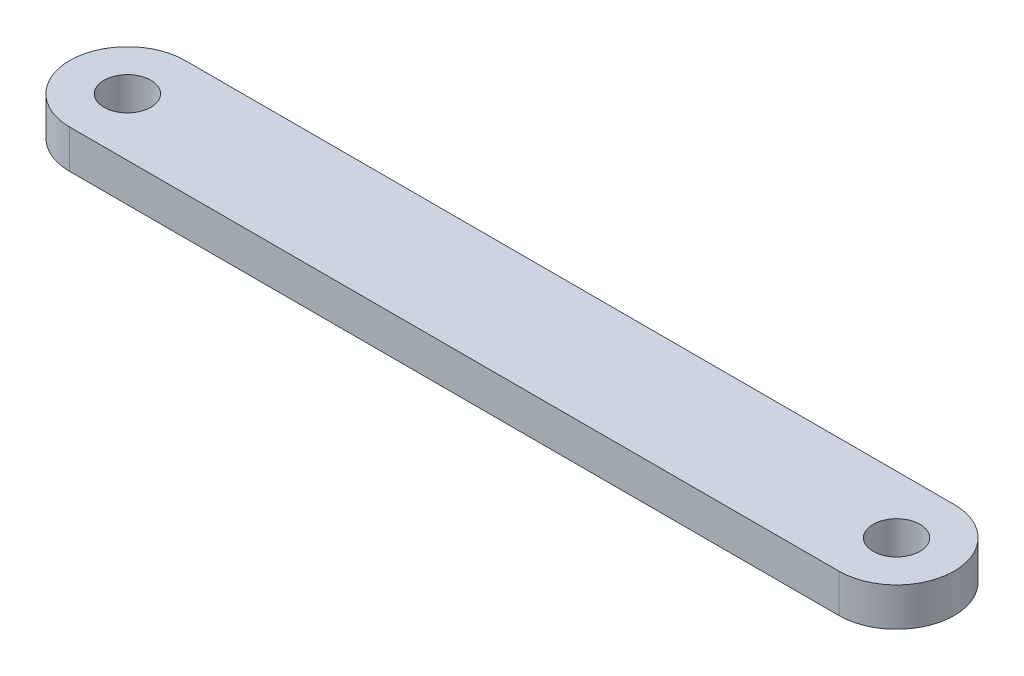
ISO-10303-21;
HEADER;
FILE_DESCRIPTION(('STEP AP214'),'2;1');
FILE_NAME('part.step','',(''),(''),'','','');
FILE_SCHEMA(('AUTOMOTIVE_DESIGN { 1 0 10303 214 1 1 1 1 }'));
ENDSEC;
DATA;
#1=APPLICATION_CONTEXT('core data for automotive mechanical design processes');
#2=APPLICATION_PROTOCOL_DEFINITION('international standard','automotive_design',2000,#1);
#3=PRODUCT_CONTEXT('',#1,'mechanical');
#4=PRODUCT('Part','Part','',(#3));
#5=PRODUCT_RELATED_PRODUCT_CATEGORY('part','',(#4));
#6=PRODUCT_DEFINITION_FORMATION('','',#4);
#7=PRODUCT_DEFINITION_CONTEXT('part definition',#1,'design');
#8=PRODUCT_DEFINITION('design','',#6,#7);
#9=PRODUCT_DEFINITION_SHAPE('','',#8);
#10=(LENGTH_UNIT() NAMED_UNIT(*) SI_UNIT(.MILLI.,.METRE.));
#11=(NAMED_UNIT(*) PLANE_ANGLE_UNIT() SI_UNIT($,.RADIAN.));
#12=(NAMED_UNIT(*) SI_UNIT($,.STERADIAN.) SOLID_ANGLE_UNIT());
#13=UNCERTAINTY_MEASURE_WITH_UNIT(LENGTH_MEASURE(1.E-05),#10,'distance_accuracy_value','');
#14=(GEOMETRIC_REPRESENTATION_CONTEXT(3) GLOBAL_UNCERTAINTY_ASSIGNED_CONTEXT((#13)) GLOBAL_UNIT_ASSIGNED_CONTEXT((#10,
#11,#12)) REPRESENTATION_CONTEXT('',''));
#15=CARTESIAN_POINT('',(0.,0.,0.));
#16=DIRECTION('',(0.,0.,1.));
#17=DIRECTION('',(1.,0.,0.));
#18=AXIS2_PLACEMENT_3D('',#15,#16,#17);
#19=CARTESIAN_POINT('',(0.,2.54,0.));
#20=DIRECTION('',(0.,1.,0.));
#21=DIRECTION('',(0.,0.,1.));
#22=AXIS2_PLACEMENT_3D('',#19,#20,#21);
#23=PLANE('',#22);
#24=CARTESIAN_POINT('',(-50.8,2.54,0.));
#25=DIRECTION('',(0.,1.,0.));
#26=DIRECTION('',(0.,0.,1.));
#27=AXIS2_PLACEMENT_3D('',#24,#25,#26);
#28=CIRCLE('',#27,1.55);
#29=CARTESIAN_POINT('',(-50.8,2.54,1.55));
#30=VERTEX_POINT('',#29);
#31=EDGE_CURVE('E118',#30,#30,#28,.T.);
#32=ORIENTED_EDGE('',*,*,#31,.F.);
#33=EDGE_LOOP('',(#32));
#34=FACE_BOUND('',#33,.T.);
#35=CARTESIAN_POINT('',(0.,2.54,0.));
#36=DIRECTION('',(0.,1.,0.));
#37=DIRECTION('',(0.,0.,1.));
#38=AXIS2_PLACEMENT_3D('',#35,#36,#37);
#39=CIRCLE('',#38,3.81);
#40=CARTESIAN_POINT('',(0.,2.54,3.81));
#41=VERTEX_POINT('',#40);
#42=CARTESIAN_POINT('',(0.,2.54,-3.81));
#43=VERTEX_POINT('',#42);
#44=EDGE_CURVE('E98',#41,#43,#39,.T.);
#45=ORIENTED_EDGE('',*,*,#44,.T.);
#46=DIRECTION('',(-1.,0.,0.));
#47=VECTOR('',#46,1.);
#48=CARTESIAN_POINT('',(0.,2.54,-3.81));
#49=LINE('',#48,#47);
#50=CARTESIAN_POINT('',(-50.8,2.54,-3.81));
#51=VERTEX_POINT('',#50);
#52=EDGE_CURVE('E93',#43,#51,#49,.T.);
#53=ORIENTED_EDGE('',*,*,#52,.T.);
#54=CARTESIAN_POINT('',(-50.8,2.54,0.));
#55=DIRECTION('',(0.,1.,0.));
#56=DIRECTION('',(0.,0.,1.));
#57=AXIS2_PLACEMENT_3D('',#54,#55,#56);
#58=CIRCLE('',#57,3.81);
#59=CARTESIAN_POINT('',(-50.8,2.54,3.81000000000001));
#60=VERTEX_POINT('',#59);
#61=EDGE_CURVE('E96',#51,#60,#58,.T.);
#62=ORIENTED_EDGE('',*,*,#61,.T.);
#63=DIRECTION('',(1.,0.,0.));
#64=VECTOR('',#63,1.);
#65=CARTESIAN_POINT('',(0.,2.54,3.81));
#66=LINE('',#65,#64);
#67=EDGE_CURVE('E63',#60,#41,#66,.T.);
#68=ORIENTED_EDGE('',*,*,#67,.T.);
#69=EDGE_LOOP('',(#45,#53,#62,#68));
#70=FACE_BOUND('',#69,.T.);
#71=CARTESIAN_POINT('',(0.,2.54,0.));
#72=DIRECTION('',(0.,1.,0.));
#73=DIRECTION('',(0.,0.,1.));
#74=AXIS2_PLACEMENT_3D('',#71,#72,#73);
#75=CIRCLE('',#74,1.55);
#76=CARTESIAN_POINT('',(0.,2.54,1.55));
#77=VERTEX_POINT('',#76);
#78=EDGE_CURVE('E140',#77,#77,#75,.T.);
#79=ORIENTED_EDGE('',*,*,#78,.F.);
#80=EDGE_LOOP('',(#79));
#81=FACE_BOUND('',#80,.T.);
#82=ADVANCED_FACE('F45',(#34,#70,#81),#23,.T.);
#83=CARTESIAN_POINT('',(0.,0.,0.));
#84=DIRECTION('',(0.,1.,0.));
#85=DIRECTION('',(0.,0.,1.));
#86=AXIS2_PLACEMENT_3D('',#83,#84,#85);
#87=PLANE('',#86);
#88=CARTESIAN_POINT('',(0.,0.,0.));
#89=DIRECTION('',(0.,1.,0.));
#90=DIRECTION('',(0.,0.,1.));
#91=AXIS2_PLACEMENT_3D('',#88,#89,#90);
#92=CIRCLE('',#91,3.81);
#93=CARTESIAN_POINT('',(0.,0.,3.81));
#94=VERTEX_POINT('',#93);
#95=CARTESIAN_POINT('',(0.,0.,-3.81));
#96=VERTEX_POINT('',#95);
#97=EDGE_CURVE('E114',#94,#96,#92,.T.);
#98=ORIENTED_EDGE('',*,*,#97,.F.);
#99=DIRECTION('',(1.,0.,0.));
#100=VECTOR('',#99,1.);
#101=CARTESIAN_POINT('',(0.,0.,3.81));
#102=LINE('',#101,#100);
#103=CARTESIAN_POINT('',(-50.8,0.,3.81000000000001));
#104=VERTEX_POINT('',#103);
#105=EDGE_CURVE('E86',#104,#94,#102,.T.);
#106=ORIENTED_EDGE('',*,*,#105,.F.);
#107=CARTESIAN_POINT('',(-50.8,0.,0.));
#108=DIRECTION('',(0.,1.,0.));
#109=DIRECTION('',(0.,0.,1.));
#110=AXIS2_PLACEMENT_3D('',#107,#108,#109);
#111=CIRCLE('',#110,3.81);
#112=CARTESIAN_POINT('',(-50.8,0.,-3.81));
#113=VERTEX_POINT('',#112);
#114=EDGE_CURVE('E80',#113,#104,#111,.T.);
#115=ORIENTED_EDGE('',*,*,#114,.F.);
#116=DIRECTION('',(-1.,0.,0.));
#117=VECTOR('',#116,1.);
#118=CARTESIAN_POINT('',(0.,0.,-3.81));
#119=LINE('',#118,#117);
#120=EDGE_CURVE('E103',#96,#113,#119,.T.);
#121=ORIENTED_EDGE('',*,*,#120,.F.);
#122=EDGE_LOOP('',(#98,#106,#115,#121));
#123=FACE_BOUND('',#122,.T.);
#124=CARTESIAN_POINT('',(-50.8,0.,0.));
#125=DIRECTION('',(0.,1.,0.));
#126=DIRECTION('',(0.,0.,1.));
#127=AXIS2_PLACEMENT_3D('',#124,#125,#126);
#128=CIRCLE('',#127,1.55);
#129=CARTESIAN_POINT('',(-50.8,0.,1.55));
#130=VERTEX_POINT('',#129);
#131=EDGE_CURVE('E136',#130,#130,#128,.T.);
#132=ORIENTED_EDGE('',*,*,#131,.T.);
#133=EDGE_LOOP('',(#132));
#134=FACE_BOUND('',#133,.T.);
#135=CARTESIAN_POINT('',(0.,0.,0.));
#136=DIRECTION('',(0.,1.,0.));
#137=DIRECTION('',(0.,0.,1.));
#138=AXIS2_PLACEMENT_3D('',#135,#136,#137);
#139=CIRCLE('',#138,1.55);
#140=CARTESIAN_POINT('',(0.,0.,1.55));
#141=VERTEX_POINT('',#140);
#142=EDGE_CURVE('E144',#141,#141,#139,.T.);
#143=ORIENTED_EDGE('',*,*,#142,.T.);
#144=EDGE_LOOP('',(#143));
#145=FACE_BOUND('',#144,.T.);
#146=ADVANCED_FACE('F131',(#123,#134,#145),#87,.F.);
#147=CARTESIAN_POINT('',(0.,2.54,0.));
#148=DIRECTION('',(0.,-1.,0.));
#149=DIRECTION('',(0.,0.,-1.));
#150=AXIS2_PLACEMENT_3D('',#147,#148,#149);
#151=CYLINDRICAL_SURFACE('',#150,3.81);
#152=ORIENTED_EDGE('',*,*,#97,.T.);
#153=DIRECTION('',(0.,-1.,0.));
#154=VECTOR('',#153,1.);
#155=CARTESIAN_POINT('',(0.,2.54,-3.81));
#156=LINE('',#155,#154);
#157=EDGE_CURVE('E11',#43,#96,#156,.T.);
#158=ORIENTED_EDGE('',*,*,#157,.F.);
#159=ORIENTED_EDGE('',*,*,#44,.F.);
#160=DIRECTION('',(0.,-1.,0.));
#161=VECTOR('',#160,1.);
#162=CARTESIAN_POINT('',(0.,2.54,3.81));
#163=LINE('',#162,#161);
#164=EDGE_CURVE('E110',#41,#94,#163,.T.);
#165=ORIENTED_EDGE('',*,*,#164,.T.);
#166=EDGE_LOOP('',(#152,#158,#159,#165));
#167=FACE_BOUND('',#166,.T.);
#168=ADVANCED_FACE('F47',(#167),#151,.T.);
#169=CARTESIAN_POINT('',(0.,2.54,-3.81));
#170=DIRECTION('',(0.,0.,1.));
#171=DIRECTION('',(1.,0.,0.));
#172=AXIS2_PLACEMENT_3D('',#169,#170,#171);
#173=PLANE('',#172);
#174=ORIENTED_EDGE('',*,*,#120,.T.);
#175=DIRECTION('',(0.,-1.,0.));
#176=VECTOR('',#175,1.);
#177=CARTESIAN_POINT('',(-50.8,2.54,-3.81));
#178=LINE('',#177,#176);
#179=EDGE_CURVE('E55',#51,#113,#178,.T.);
#180=ORIENTED_EDGE('',*,*,#179,.F.);
#181=ORIENTED_EDGE('',*,*,#52,.F.);
#182=ORIENTED_EDGE('',*,*,#157,.T.);
#183=EDGE_LOOP('',(#174,#180,#181,#182));
#184=FACE_BOUND('',#183,.T.);
#185=ADVANCED_FACE('F102',(#184),#173,.F.);
#186=CARTESIAN_POINT('',(-50.8,2.54,0.));
#187=DIRECTION('',(0.,-1.,0.));
#188=DIRECTION('',(0.,0.,-1.));
#189=AXIS2_PLACEMENT_3D('',#186,#187,#188);
#190=CYLINDRICAL_SURFACE('',#189,3.81);
#191=ORIENTED_EDGE('',*,*,#114,.T.);
#192=DIRECTION('',(0.,-1.,0.));
#193=VECTOR('',#192,1.);
#194=CARTESIAN_POINT('',(-50.8,2.54,3.81000000000001));
#195=LINE('',#194,#193);
#196=EDGE_CURVE('E105',#60,#104,#195,.T.);
#197=ORIENTED_EDGE('',*,*,#196,.F.);
#198=ORIENTED_EDGE('',*,*,#61,.F.);
#199=ORIENTED_EDGE('',*,*,#179,.T.);
#200=EDGE_LOOP('',(#191,#197,#198,#199));
#201=FACE_BOUND('',#200,.T.);
#202=ADVANCED_FACE('F106',(#201),#190,.T.);
#203=CARTESIAN_POINT('',(0.,2.54,3.81));
#204=DIRECTION('',(0.,0.,-1.));
#205=DIRECTION('',(-1.,0.,0.));
#206=AXIS2_PLACEMENT_3D('',#203,#204,#205);
#207=PLANE('',#206);
#208=ORIENTED_EDGE('',*,*,#105,.T.);
#209=ORIENTED_EDGE('',*,*,#164,.F.);
#210=ORIENTED_EDGE('',*,*,#67,.F.);
#211=ORIENTED_EDGE('',*,*,#196,.T.);
#212=EDGE_LOOP('',(#208,#209,#210,#211));
#213=FACE_BOUND('',#212,.T.);
#214=ADVANCED_FACE('F128',(#213),#207,.F.);
#215=CARTESIAN_POINT('',(-50.8,2.54,0.));
#216=DIRECTION('',(0.,-1.,0.));
#217=DIRECTION('',(0.,0.,-1.));
#218=AXIS2_PLACEMENT_3D('',#215,#216,#217);
#219=CYLINDRICAL_SURFACE('',#218,1.55);
#220=ORIENTED_EDGE('',*,*,#31,.T.);
#221=EDGE_LOOP('',(#220));
#222=FACE_BOUND('',#221,.T.);
#223=ORIENTED_EDGE('',*,*,#131,.F.);
#224=EDGE_LOOP('',(#223));
#225=FACE_BOUND('',#224,.T.);
#226=ADVANCED_FACE('F163',(#222,#225),#219,.F.);
#227=CARTESIAN_POINT('',(0.,2.54,0.));
#228=DIRECTION('',(0.,-1.,0.));
#229=DIRECTION('',(0.,0.,-1.));
#230=AXIS2_PLACEMENT_3D('',#227,#228,#229);
#231=CYLINDRICAL_SURFACE('',#230,1.55);
#232=ORIENTED_EDGE('',*,*,#78,.T.);
#233=EDGE_LOOP('',(#232));
#234=FACE_BOUND('',#233,.T.);
#235=ORIENTED_EDGE('',*,*,#142,.F.);
#236=EDGE_LOOP('',(#235));
#237=FACE_BOUND('',#236,.T.);
#238=ADVANCED_FACE('F152',(#234,#237),#231,.F.);
#239=CLOSED_SHELL('',(#82,#146,#168,#185,#202,#214,#226,#238));
#240=MANIFOLD_SOLID_BREP('B2',#239);
#241=ADVANCED_BREP_SHAPE_REPRESENTATION('',(#18,#240),#14);
#242=SHAPE_DEFINITION_REPRESENTATION(#9,#241);
ENDSEC;
END-ISO-10303-21;
